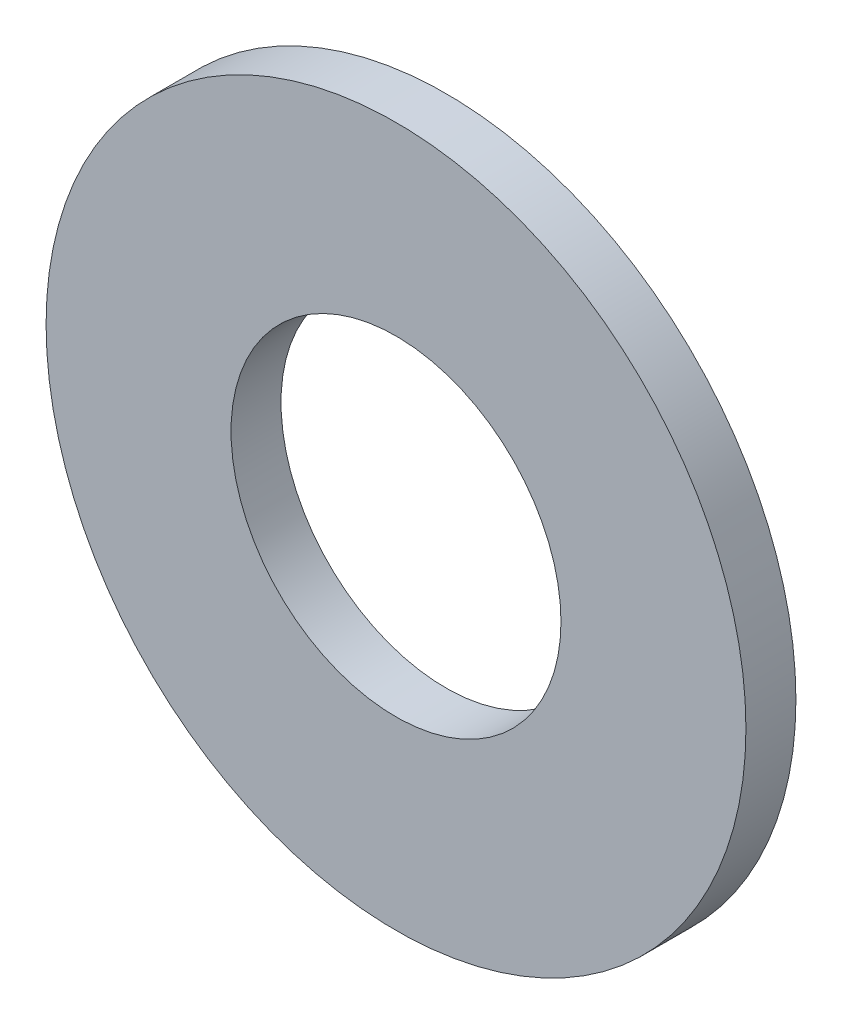
ISO-10303-21;
HEADER;
FILE_DESCRIPTION(('STEP AP214'),'2;1');
FILE_NAME('part.step','',(''),(''),'','','');
FILE_SCHEMA(('AUTOMOTIVE_DESIGN { 1 0 10303 214 1 1 1 1 }'));
ENDSEC;
DATA;
#1=APPLICATION_CONTEXT('core data for automotive mechanical design processes');
#2=APPLICATION_PROTOCOL_DEFINITION('international standard','automotive_design',2000,#1);
#3=PRODUCT_CONTEXT('',#1,'mechanical');
#4=PRODUCT('Part','Part','',(#3));
#5=PRODUCT_RELATED_PRODUCT_CATEGORY('part','',(#4));
#6=PRODUCT_DEFINITION_FORMATION('','',#4);
#7=PRODUCT_DEFINITION_CONTEXT('part definition',#1,'design');
#8=PRODUCT_DEFINITION('design','',#6,#7);
#9=PRODUCT_DEFINITION_SHAPE('','',#8);
#10=(LENGTH_UNIT() NAMED_UNIT(*) SI_UNIT(.MILLI.,.METRE.));
#11=(NAMED_UNIT(*) PLANE_ANGLE_UNIT() SI_UNIT($,.RADIAN.));
#12=(NAMED_UNIT(*) SI_UNIT($,.STERADIAN.) SOLID_ANGLE_UNIT());
#13=UNCERTAINTY_MEASURE_WITH_UNIT(LENGTH_MEASURE(1.E-05),#10,'distance_accuracy_value','');
#14=(GEOMETRIC_REPRESENTATION_CONTEXT(3) GLOBAL_UNCERTAINTY_ASSIGNED_CONTEXT((#13)) GLOBAL_UNIT_ASSIGNED_CONTEXT((#10,
#11,#12)) REPRESENTATION_CONTEXT('',''));
#15=CARTESIAN_POINT('',(0.,0.,0.));
#16=DIRECTION('',(0.,0.,1.));
#17=DIRECTION('',(1.,0.,0.));
#18=AXIS2_PLACEMENT_3D('',#15,#16,#17);
#19=CARTESIAN_POINT('',(0.,0.,0.25));
#20=DIRECTION('',(0.,0.,1.));
#21=DIRECTION('',(1.,0.,0.));
#22=AXIS2_PLACEMENT_3D('',#19,#20,#21);
#23=PLANE('',#22);
#24=CARTESIAN_POINT('',(0.,0.,0.25));
#25=DIRECTION('',(0.,0.,1.));
#26=DIRECTION('',(1.,0.,0.));
#27=AXIS2_PLACEMENT_3D('',#24,#25,#26);
#28=CIRCLE('',#27,3.5);
#29=CARTESIAN_POINT('',(3.5,0.,0.25));
#30=VERTEX_POINT('',#29);
#31=EDGE_CURVE('E10',#30,#30,#28,.T.);
#32=ORIENTED_EDGE('',*,*,#31,.T.);
#33=EDGE_LOOP('',(#32));
#34=FACE_BOUND('',#33,.T.);
#35=CARTESIAN_POINT('',(0.,0.,0.25));
#36=DIRECTION('',(0.,0.,1.));
#37=DIRECTION('',(1.,0.,0.));
#38=AXIS2_PLACEMENT_3D('',#35,#36,#37);
#39=CIRCLE('',#38,1.65);
#40=CARTESIAN_POINT('',(1.65,0.,0.25));
#41=VERTEX_POINT('',#40);
#42=EDGE_CURVE('E60',#41,#41,#39,.T.);
#43=ORIENTED_EDGE('',*,*,#42,.F.);
#44=EDGE_LOOP('',(#43));
#45=FACE_BOUND('',#44,.T.);
#46=ADVANCED_FACE('F44',(#34,#45),#23,.T.);
#47=CARTESIAN_POINT('',(0.,0.,-0.25));
#48=DIRECTION('',(0.,0.,1.));
#49=DIRECTION('',(1.,0.,0.));
#50=AXIS2_PLACEMENT_3D('',#47,#48,#49);
#51=PLANE('',#50);
#52=CARTESIAN_POINT('',(0.,0.,-0.25));
#53=DIRECTION('',(0.,0.,1.));
#54=DIRECTION('',(1.,0.,0.));
#55=AXIS2_PLACEMENT_3D('',#52,#53,#54);
#56=CIRCLE('',#55,3.5);
#57=CARTESIAN_POINT('',(3.5,0.,-0.25));
#58=VERTEX_POINT('',#57);
#59=EDGE_CURVE('E49',#58,#58,#56,.T.);
#60=ORIENTED_EDGE('',*,*,#59,.F.);
#61=EDGE_LOOP('',(#60));
#62=FACE_BOUND('',#61,.T.);
#63=CARTESIAN_POINT('',(0.,0.,-0.25));
#64=DIRECTION('',(0.,0.,1.));
#65=DIRECTION('',(1.,0.,0.));
#66=AXIS2_PLACEMENT_3D('',#63,#64,#65);
#67=CIRCLE('',#66,1.65);
#68=CARTESIAN_POINT('',(1.65,0.,-0.25));
#69=VERTEX_POINT('',#68);
#70=EDGE_CURVE('E56',#69,#69,#67,.T.);
#71=ORIENTED_EDGE('',*,*,#70,.T.);
#72=EDGE_LOOP('',(#71));
#73=FACE_BOUND('',#72,.T.);
#74=ADVANCED_FACE('F66',(#62,#73),#51,.F.);
#75=CARTESIAN_POINT('',(0.,0.,0.25));
#76=DIRECTION('',(0.,0.,-1.));
#77=DIRECTION('',(-1.,0.,0.));
#78=AXIS2_PLACEMENT_3D('',#75,#76,#77);
#79=CYLINDRICAL_SURFACE('',#78,3.5);
#80=ORIENTED_EDGE('',*,*,#31,.F.);
#81=EDGE_LOOP('',(#80));
#82=FACE_BOUND('',#81,.T.);
#83=ORIENTED_EDGE('',*,*,#59,.T.);
#84=EDGE_LOOP('',(#83));
#85=FACE_BOUND('',#84,.T.);
#86=ADVANCED_FACE('F48',(#82,#85),#79,.T.);
#87=CARTESIAN_POINT('',(0.,0.,0.25));
#88=DIRECTION('',(0.,0.,-1.));
#89=DIRECTION('',(-1.,0.,0.));
#90=AXIS2_PLACEMENT_3D('',#87,#88,#89);
#91=CYLINDRICAL_SURFACE('',#90,1.65);
#92=ORIENTED_EDGE('',*,*,#42,.T.);
#93=EDGE_LOOP('',(#92));
#94=FACE_BOUND('',#93,.T.);
#95=ORIENTED_EDGE('',*,*,#70,.F.);
#96=EDGE_LOOP('',(#95));
#97=FACE_BOUND('',#96,.T.);
#98=ADVANCED_FACE('F65',(#94,#97),#91,.F.);
#99=CLOSED_SHELL('',(#46,#74,#86,#98));
#100=MANIFOLD_SOLID_BREP('B2',#99);
#101=ADVANCED_BREP_SHAPE_REPRESENTATION('',(#18,#100),#14);
#102=SHAPE_DEFINITION_REPRESENTATION(#9,#101);
ENDSEC;
END-ISO-10303-21;
